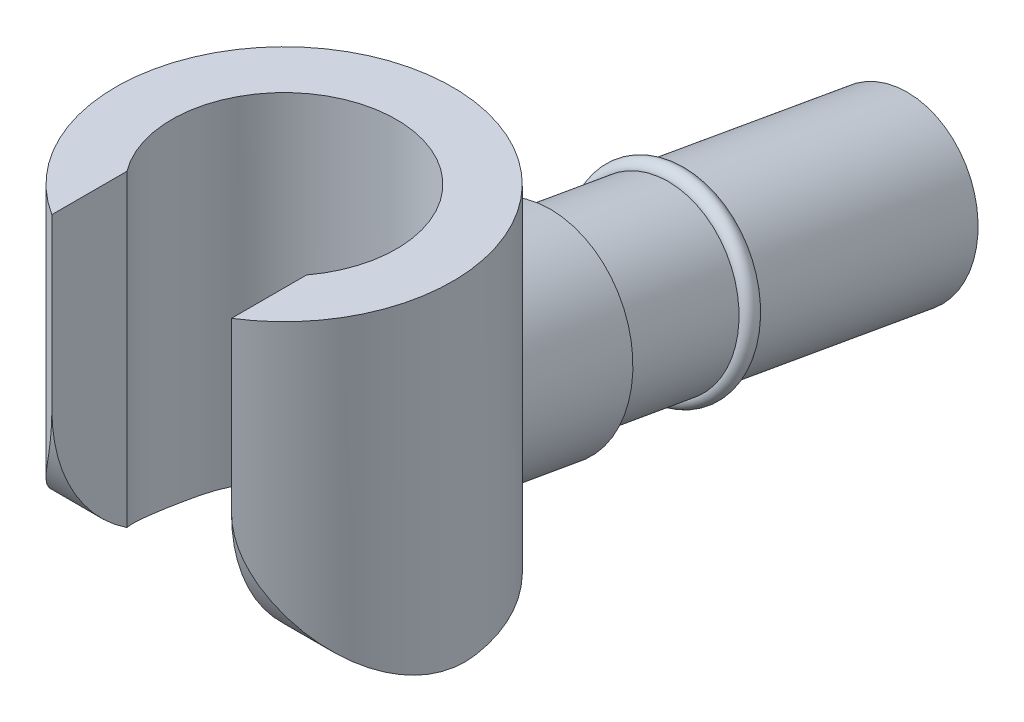
ISO-10303-21;
HEADER;
FILE_DESCRIPTION(('STEP AP214'),'2;1');
FILE_NAME('part.step','',(''),(''),'','','');
FILE_SCHEMA(('AUTOMOTIVE_DESIGN { 1 0 10303 214 1 1 1 1 }'));
ENDSEC;
DATA;
#1=APPLICATION_CONTEXT('core data for automotive mechanical design processes');
#2=APPLICATION_PROTOCOL_DEFINITION('international standard','automotive_design',2000,#1);
#3=PRODUCT_CONTEXT('',#1,'mechanical');
#4=PRODUCT('Part','Part','',(#3));
#5=PRODUCT_RELATED_PRODUCT_CATEGORY('part','',(#4));
#6=PRODUCT_DEFINITION_FORMATION('','',#4);
#7=PRODUCT_DEFINITION_CONTEXT('part definition',#1,'design');
#8=PRODUCT_DEFINITION('design','',#6,#7);
#9=PRODUCT_DEFINITION_SHAPE('','',#8);
#10=(LENGTH_UNIT() NAMED_UNIT(*) SI_UNIT(.MILLI.,.METRE.));
#11=(NAMED_UNIT(*) PLANE_ANGLE_UNIT() SI_UNIT($,.RADIAN.));
#12=(NAMED_UNIT(*) SI_UNIT($,.STERADIAN.) SOLID_ANGLE_UNIT());
#13=UNCERTAINTY_MEASURE_WITH_UNIT(LENGTH_MEASURE(1.E-05),#10,'distance_accuracy_value','');
#14=(GEOMETRIC_REPRESENTATION_CONTEXT(3) GLOBAL_UNCERTAINTY_ASSIGNED_CONTEXT((#13)) GLOBAL_UNIT_ASSIGNED_CONTEXT((#10,
#11,#12)) REPRESENTATION_CONTEXT('',''));
#15=CARTESIAN_POINT('',(0.,0.,0.));
#16=DIRECTION('',(0.,0.,1.));
#17=DIRECTION('',(1.,0.,0.));
#18=AXIS2_PLACEMENT_3D('',#15,#16,#17);
#19=CARTESIAN_POINT('',(0.,2.26255128198767,2.45629642090024));
#20=DIRECTION('',(0.,-0.173648177666936,-0.984807753012214));
#21=DIRECTION('',(0.,0.984807753012216,-0.173648177666936));
#22=AXIS2_PLACEMENT_3D('',#19,#20,#21);
#23=CYLINDRICAL_SURFACE('',#22,1.190625);
#24=CARTESIAN_POINT('',(0.,1.20817697351663,-3.52335742580348));
#25=DIRECTION('',(0.,-0.173648177666935,-0.984807753012214));
#26=DIRECTION('',(0.,0.984807753012216,-0.173648177666936));
#27=AXIS2_PLACEMENT_3D('',#24,#25,#26);
#28=CIRCLE('',#27,1.190625);
#29=CARTESIAN_POINT('',(0.,2.3807137044468,-3.73010728733817));
#30=VERTEX_POINT('',#29);
#31=EDGE_CURVE('E11',#30,#30,#28,.F.);
#32=ORIENTED_EDGE('',*,*,#31,.F.);
#33=EDGE_LOOP('',(#32));
#34=FACE_BOUND('',#33,.T.);
#35=CARTESIAN_POINT('',(0.,0.908232061213911,-5.22442955383261));
#36=DIRECTION('',(0.,-0.173648177666935,-0.984807753012214));
#37=DIRECTION('',(0.,0.984807753012216,-0.173648177666936));
#38=AXIS2_PLACEMENT_3D('',#35,#36,#37);
#39=CIRCLE('',#38,1.190625);
#40=CARTESIAN_POINT('',(0.,2.08076879214408,-5.4311794153673));
#41=VERTEX_POINT('',#40);
#42=EDGE_CURVE('E40',#41,#41,#39,.F.);
#43=ORIENTED_EDGE('',*,*,#42,.T.);
#44=EDGE_LOOP('',(#43));
#45=FACE_BOUND('',#44,.T.);
#46=ADVANCED_FACE('F35',(#34,#45),#23,.T.);
#47=CARTESIAN_POINT('',(0.,4.76250000000001,0.));
#48=DIRECTION('',(0.,1.00000000000001,0.));
#49=DIRECTION('',(0.,0.,1.00000000000001));
#50=AXIS2_PLACEMENT_3D('',#47,#48,#49);
#51=PLANE('',#50);
#52=DIRECTION('',(0.,0.,1.00000000000001));
#53=VECTOR('',#52,1.);
#54=CARTESIAN_POINT('',(-1.27000000000003,4.76250000000003,3.49250000000005));
#55=LINE('',#54,#53);
#56=CARTESIAN_POINT('',(-1.27000000000001,4.76250000000001,0.952500000000034));
#57=VERTEX_POINT('',#56);
#58=CARTESIAN_POINT('',(-1.27,4.7625,2.01431168454639));
#59=VERTEX_POINT('',#58);
#60=EDGE_CURVE('E115',#57,#59,#55,.T.);
#61=ORIENTED_EDGE('',*,*,#60,.F.);
#62=CARTESIAN_POINT('',(0.,4.76250000000001,0.));
#63=DIRECTION('',(0.,1.00000000000001,0.));
#64=DIRECTION('',(0.,0.,1.00000000000001));
#65=AXIS2_PLACEMENT_3D('',#62,#63,#64);
#66=CIRCLE('',#65,1.5875);
#67=CARTESIAN_POINT('',(1.26999999999997,4.76250000000007,0.952500000000031));
#68=VERTEX_POINT('',#67);
#69=EDGE_CURVE('E121',#68,#57,#66,.T.);
#70=ORIENTED_EDGE('',*,*,#69,.F.);
#71=DIRECTION('',(0.,0.,-1.00000000000001));
#72=VECTOR('',#71,1.);
#73=CARTESIAN_POINT('',(1.26999999999998,4.76250000000002,3.49250000000005));
#74=LINE('',#73,#72);
#75=CARTESIAN_POINT('',(1.27000000000001,4.7625,2.01431168454639));
#76=VERTEX_POINT('',#75);
#77=EDGE_CURVE('E292',#76,#68,#74,.T.);
#78=ORIENTED_EDGE('',*,*,#77,.F.);
#79=CARTESIAN_POINT('',(0.,4.76250000000001,0.));
#80=DIRECTION('',(0.,1.00000000000001,0.));
#81=DIRECTION('',(0.,0.,1.00000000000001));
#82=AXIS2_PLACEMENT_3D('',#79,#80,#81);
#83=CIRCLE('',#82,2.38125);
#84=EDGE_CURVE('E111',#76,#59,#83,.T.);
#85=ORIENTED_EDGE('',*,*,#84,.T.);
#86=EDGE_LOOP('',(#61,#70,#78,#85));
#87=FACE_BOUND('',#86,.T.);
#88=ADVANCED_FACE('F164',(#87),#51,.T.);
#89=CARTESIAN_POINT('',(0.,0.,0.));
#90=DIRECTION('',(0.,1.00000000000001,0.));
#91=DIRECTION('',(0.,0.,1.00000000000001));
#92=AXIS2_PLACEMENT_3D('',#89,#90,#91);
#93=PLANE('',#92);
#94=CARTESIAN_POINT('',(0.,0.,0.));
#95=DIRECTION('',(0.,1.00000000000001,0.));
#96=DIRECTION('',(0.,0.,1.00000000000001));
#97=AXIS2_PLACEMENT_3D('',#94,#95,#96);
#98=CIRCLE('',#97,2.38125);
#99=CARTESIAN_POINT('',(2.35280849946442,0.,-0.366938315453636));
#100=VERTEX_POINT('',#99);
#101=CARTESIAN_POINT('',(0.,0.,-2.38125));
#102=VERTEX_POINT('',#101);
#103=EDGE_CURVE('E131',#100,#102,#98,.T.);
#104=ORIENTED_EDGE('',*,*,#103,.F.);
#105=DIRECTION('',(1.,0.,0.));
#106=VECTOR('',#105,1.);
#107=CARTESIAN_POINT('',(-2.38124999999999,0.,-0.366938315453613));
#108=LINE('',#107,#106);
#109=CARTESIAN_POINT('',(1.5445104475697,0.,-0.36693831545363));
#110=VERTEX_POINT('',#109);
#111=EDGE_CURVE('E214',#110,#100,#108,.T.);
#112=ORIENTED_EDGE('',*,*,#111,.F.);
#113=CARTESIAN_POINT('',(0.,0.,0.));
#114=DIRECTION('',(0.,1.00000000000001,0.));
#115=DIRECTION('',(0.,0.,1.00000000000001));
#116=AXIS2_PLACEMENT_3D('',#113,#114,#115);
#117=CIRCLE('',#116,1.5875);
#118=CARTESIAN_POINT('',(-1.54451044756971,0.,-0.366938315453627));
#119=VERTEX_POINT('',#118);
#120=EDGE_CURVE('E117',#110,#119,#117,.T.);
#121=ORIENTED_EDGE('',*,*,#120,.T.);
#122=CARTESIAN_POINT('',(-2.35280849946437,0.,-0.36693831545362));
#123=VERTEX_POINT('',#122);
#124=EDGE_CURVE('E217',#123,#119,#108,.T.);
#125=ORIENTED_EDGE('',*,*,#124,.F.);
#126=EDGE_CURVE('E100',#102,#123,#98,.T.);
#127=ORIENTED_EDGE('',*,*,#126,.F.);
#128=EDGE_LOOP('',(#104,#112,#121,#125,#127));
#129=FACE_BOUND('',#128,.T.);
#130=ADVANCED_FACE('F205',(#129),#93,.F.);
#131=CARTESIAN_POINT('',(0.,4.76250000000001,0.));
#132=DIRECTION('',(0.,-1.00000000000001,0.));
#133=DIRECTION('',(0.,0.,-1.00000000000001));
#134=AXIS2_PLACEMENT_3D('',#131,#132,#133);
#135=CYLINDRICAL_SURFACE('',#134,2.38125);
#136=ORIENTED_EDGE('',*,*,#103,.T.);
#137=CARTESIAN_POINT('',(0.,2.81912265510655,-2.38125));
#138=CARTESIAN_POINT('',(0.0747045796572156,2.81912579107448,-2.38125374631095));
#139=CARTESIAN_POINT('',(0.149385088903327,2.81360378097245,-2.37770841714588));
#140=CARTESIAN_POINT('',(0.296483738355653,2.79173704283781,-2.3638743608229));
#141=CARTESIAN_POINT('',(0.368902283545486,2.77539426392966,-2.35358684812505));
#142=CARTESIAN_POINT('',(0.509312109977818,2.73249155811069,-2.32724061387244));
#143=CARTESIAN_POINT('',(0.57731359470601,2.70595623433348,-2.31119579560264));
#144=CARTESIAN_POINT('',(0.70751132566848,2.64337324079094,-2.27472081697133));
#145=CARTESIAN_POINT('',(0.769705690759084,2.60732250299923,-2.25428924259832));
#146=CARTESIAN_POINT('',(0.889824094715473,2.52447635497403,-2.2097197178262));
#147=CARTESIAN_POINT('',(0.947402772687572,2.47725033799423,-2.18545143416963));
#148=CARTESIAN_POINT('',(1.05359803292886,2.37380660529656,-2.13628456547099));
#149=CARTESIAN_POINT('',(1.10220844548083,2.31758274880659,-2.11138555981778));
#150=CARTESIAN_POINT('',(1.19073500714924,2.19474273874581,-2.06279935468717));
#151=CARTESIAN_POINT('',(1.23028437176825,2.12783016596952,-2.03918578797535));
#152=CARTESIAN_POINT('',(1.29685937748784,1.98650422951831,-1.99751467909763));
#153=CARTESIAN_POINT('',(1.32390715705662,1.91210441147608,-1.97944733459785));
#154=CARTESIAN_POINT('',(1.36197546581325,1.76694546780592,-1.95342017400552));
#155=CARTESIAN_POINT('',(1.37447267635764,1.69673967431193,-1.94454224231147));
#156=CARTESIAN_POINT('',(1.38842809651082,1.55471626995253,-1.93460528849596));
#157=CARTESIAN_POINT('',(1.38988997829053,1.48289920324189,-1.93354366538366));
#158=CARTESIAN_POINT('',(1.38268707680189,1.34721676601847,-1.93869409808814));
#159=CARTESIAN_POINT('',(1.37500435612747,1.28326416683205,-1.94420088011607));
#160=CARTESIAN_POINT('',(1.35184625707245,1.15746161198252,-1.96037233336776));
#161=CARTESIAN_POINT('',(1.33636492827444,1.09561330043877,-1.97104094287239));
#162=CARTESIAN_POINT('',(1.29109132110505,0.95191590165433,-2.00110642707088));
#163=CARTESIAN_POINT('',(1.25809173413169,0.871447542320114,-2.02228060513067));
#164=CARTESIAN_POINT('',(1.18009209745056,0.717781445242191,-2.06876642991618));
#165=CARTESIAN_POINT('',(1.13506976313169,0.644597558905059,-2.09408572570341));
#166=CARTESIAN_POINT('',(1.03329995153469,0.506091957283327,-2.14614770162376));
#167=CARTESIAN_POINT('',(0.976429385460564,0.4408651930005,-2.17290293979648));
#168=CARTESIAN_POINT('',(0.851823149985452,0.321037530708833,-2.22469856259292));
#169=CARTESIAN_POINT('',(0.784106129758756,0.266418743927048,-2.24974178722177));
#170=CARTESIAN_POINT('',(0.654293775385925,0.180593225253622,-2.29037728922505));
#171=CARTESIAN_POINT('',(0.594134095313646,0.146877718908268,-2.30684309903259));
#172=CARTESIAN_POINT('',(0.468454429995739,0.0889456160084731,-2.33560365817458));
#173=CARTESIAN_POINT('',(0.402938538839858,0.0647218448689598,-2.347901556984));
#174=CARTESIAN_POINT('',(0.267560349498783,0.0270919687876584,-2.36716340667977));
#175=CARTESIAN_POINT('',(0.197670809890027,0.0137628618545022,-2.37408937420948));
#176=CARTESIAN_POINT('',(0.0563085133204287,-0.000746693032316787,-2.38163357482808));
#177=CARTESIAN_POINT('',(-0.0151633334884328,-0.0019339519794406,-2.3822553442676));
#178=CARTESIAN_POINT('',(-0.148892942619863,0.00734591798894951,-2.37742465606815));
#179=CARTESIAN_POINT('',(-0.211272888206566,0.0165008831292121,-2.37265605510732));
#180=CARTESIAN_POINT('',(-0.333483440154271,0.0438132203361232,-2.35858551488502));
#181=CARTESIAN_POINT('',(-0.393313559526001,0.0619723037987962,-2.3492827138223));
#182=CARTESIAN_POINT('',(-0.510647731471967,0.106913623953572,-2.32664103277905));
#183=CARTESIAN_POINT('',(-0.568049693744741,0.133909431077417,-2.31320274295488));
#184=CARTESIAN_POINT('',(-0.677954904139775,0.19520618317244,-2.2834132727239));
#185=CARTESIAN_POINT('',(-0.730456589015197,0.229509447932186,-2.2670611675822));
#186=CARTESIAN_POINT('',(-0.838526908980091,0.310698368467293,-2.22957939078853));
#187=CARTESIAN_POINT('',(-0.893113930731751,0.358730741505353,-2.2081093646996));
#188=CARTESIAN_POINT('',(-0.994618960631436,0.462024057496228,-2.1642893819985));
#189=CARTESIAN_POINT('',(-1.04152686281241,0.517294356425614,-2.14193831311984));
#190=CARTESIAN_POINT('',(-1.13560931713039,0.645324929605874,-2.09381063698694));
#191=CARTESIAN_POINT('',(-1.18109032473598,0.719402492980442,-2.06820479562384));
#192=CARTESIAN_POINT('',(-1.2597547242214,0.875080308012906,-2.02125503295745));
#193=CARTESIAN_POINT('',(-1.29294719231083,0.956674951767838,-1.99990797155137));
#194=CARTESIAN_POINT('',(-1.3398036984708,1.10748707022035,-1.9687283609328));
#195=CARTESIAN_POINT('',(-1.35613986876176,1.17555953152588,-1.95740349018859));
#196=CARTESIAN_POINT('',(-1.37929598158575,1.31402713923433,-1.94115995531836));
#197=CARTESIAN_POINT('',(-1.38612987735973,1.38441872427579,-1.93623189875122));
#198=CARTESIAN_POINT('',(-1.38940332064802,1.52606690252481,-1.93388719345708));
#199=CARTESIAN_POINT('',(-1.38577659344324,1.59732615018323,-1.93651843730288));
#200=CARTESIAN_POINT('',(-1.36761144819996,1.73774985358159,-1.94938693220331));
#201=CARTESIAN_POINT('',(-1.35307151919521,1.80691401787117,-1.95962523647681));
#202=CARTESIAN_POINT('',(-1.31536007481291,1.93459560603123,-1.98510369275215));
#203=CARTESIAN_POINT('',(-1.29311711534175,1.99350496366871,-1.99979008372814));
#204=CARTESIAN_POINT('',(-1.24068576162168,2.10658436072702,-2.03273384446375));
#205=CARTESIAN_POINT('',(-1.21049446057784,2.16075265661337,-2.05099252001796));
#206=CARTESIAN_POINT('',(-1.13972637319961,2.26848366649389,-2.09121471627852));
#207=CARTESIAN_POINT('',(-1.09843897586353,2.32150819263065,-2.11336522401515));
#208=CARTESIAN_POINT('',(-1.00817059543436,2.42044587532078,-2.15788779674602));
#209=CARTESIAN_POINT('',(-0.959185613427085,2.46635531080601,-2.18025997120478));
#210=CARTESIAN_POINT('',(-0.847626466245124,2.55598235274336,-2.22619981190206));
#211=CARTESIAN_POINT('',(-0.7841144166224,2.59865265885122,-2.24954921357876));
#212=CARTESIAN_POINT('',(-0.649811717696099,2.67343425210132,-2.29195517314623));
#213=CARTESIAN_POINT('',(-0.579018695630262,2.70554208268415,-2.3110103251069));
#214=CARTESIAN_POINT('',(-0.425653579441435,2.76054725812641,-2.34431763440039));
#215=CARTESIAN_POINT('',(-0.342591759641974,2.7824288376896,-2.35802337305237));
#216=CARTESIAN_POINT('',(-0.173007622446984,2.81170983558867,-2.37648436800659));
#217=CARTESIAN_POINT('',(-0.0864876799908675,2.81911902450461,-2.38124566278609));
#218=CARTESIAN_POINT('',(0.,2.81912265510655,-2.38125));
#219=B_SPLINE_CURVE_WITH_KNOTS('',3,(#137,#138,#139,#140,#141,#142,#143,#144,#145,#146,#147,
#148,#149,#150,#151,#152,#153,#154,#155,#156,#157,#158,#159,#160,#161,#162,#163,#164,#165,#166,
#167,#168,#169,#170,#171,#172,#173,#174,#175,#176,#177,#178,#179,#180,#181,#182,#183,#184,#185,
#186,#187,#188,#189,#190,#191,#192,#193,#194,#195,#196,#197,#198,#199,#200,#201,#202,#203,#204,
#205,#206,#207,#208,#209,#210,#211,#212,#213,#214,#215,#216,#217,#218),.UNSPECIFIED.,.T.,.F.,(4,
2,2,2,2,2,2,2,2,2,2,2,2,2,2,2,2,2,2,2,2,2,2,2,2,2,2,2,2,2,2,2,2,2,2,2,2,2,2,2,4),(0.,
0.223791890077953,0.447543479912333,0.670758330115147,0.894045238916025,1.12798634923095,
1.36208780402242,1.60443960140257,1.84636056941526,2.0606758512086,2.27491981323712,
2.46808753668623,2.66140287283004,2.92853536851224,3.19616648301336,3.46673056994617,
3.73683435190842,3.9487040452938,4.16041328086562,4.37360613917281,4.58667939996354,
4.77548115398571,4.96431880696962,5.15810668808142,5.35195618003641,5.57857187860413,
5.80548345400587,6.07616015106952,6.3466365279158,6.55855304934735,6.77015806049821,
6.98310666349066,7.19608475531001,7.38925470984313,7.58249540710089,7.79394781456097,
8.005510437455,8.24437331142769,8.48331427545485,8.74257979709143,9.00167022317274),.UNSPECIFIED.);
#220=EDGE_CURVE('E51',#102,#102,#219,.T.);
#221=ORIENTED_EDGE('',*,*,#220,.F.);
#222=ORIENTED_EDGE('',*,*,#126,.T.);
#223=CARTESIAN_POINT('',(-2.35280849946443,0.,-0.366938315453624));
#224=CARTESIAN_POINT('',(-2.36074691460119,-1.2068697559654E-05,-0.316115349929588));
#225=CARTESIAN_POINT('',(-2.36701472707691,0.00162679818296212,-0.265033719884144));
#226=CARTESIAN_POINT('',(-2.37622889563392,0.00821634244445592,-0.162805266586126));
#227=CARTESIAN_POINT('',(-2.37917659350035,0.0131656806476629,-0.11165847803912));
#228=CARTESIAN_POINT('',(-2.3817674058131,0.0263389998104693,-0.0100731045672685));
#229=CARTESIAN_POINT('',(-2.38143390687972,0.0345394068041282,0.040367929865583));
#230=CARTESIAN_POINT('',(-2.37763068554775,0.0541331937403573,0.140492390723611));
#231=CARTESIAN_POINT('',(-2.37416085452079,0.0655266842674731,0.190175790847151));
#232=CARTESIAN_POINT('',(-2.3592788602558,0.10429942606839,0.337407739102852));
#233=CARTESIAN_POINT('',(-2.34339848093317,0.136299394085299,0.433354093237191));
#234=CARTESIAN_POINT('',(-2.30147710153755,0.211188240909209,0.618566644854465));
#235=CARTESIAN_POINT('',(-2.27541807443287,0.254096391462621,0.707820653609243));
#236=CARTESIAN_POINT('',(-2.20568719486317,0.364212893958312,0.90522260628216));
#237=CARTESIAN_POINT('',(-2.15905186554068,0.434815536643902,1.01042932955947));
#238=CARTESIAN_POINT('',(-2.05640675035323,0.588866865313773,1.20571936102154));
#239=CARTESIAN_POINT('',(-2.00038393576449,0.672333391753616,1.29578129707531));
#240=CARTESIAN_POINT('',(-1.88220087117022,0.851690528469889,1.46228776118599));
#241=CARTESIAN_POINT('',(-1.81994245829478,0.947791172912766,1.5384334321365));
#242=CARTESIAN_POINT('',(-1.69490370000522,1.15035370429416,1.67517243601205));
#243=CARTESIAN_POINT('',(-1.63212298305714,1.25682366997208,1.73575350670034));
#244=CARTESIAN_POINT('',(-1.52871002624278,1.45039626135747,1.82668820862097));
#245=CARTESIAN_POINT('',(-1.48666850069557,1.53498560846977,1.86078812690847));
#246=CARTESIAN_POINT('',(-1.40988122850497,1.71003800492656,1.91960948860366));
#247=CARTESIAN_POINT('',(-1.37509358606246,1.8004631370978,1.94438549276727));
#248=CARTESIAN_POINT('',(-1.32302969628627,1.9713878831929,1.9800970096417));
#249=CARTESIAN_POINT('',(-1.30376434693523,2.05089519083719,1.99268616668889));
#250=CARTESIAN_POINT('',(-1.28384368681271,2.17282703779037,2.00553239947966));
#251=CARTESIAN_POINT('',(-1.27869598109969,2.21421675641082,2.00880942362392));
#252=CARTESIAN_POINT('',(-1.27175576756051,2.29747627555281,2.01320525606891));
#253=CARTESIAN_POINT('',(-1.26997046778589,2.33934691429173,2.01431942798));
#254=CARTESIAN_POINT('',(-1.27000000000028,2.38125000000013,2.01431168454641));
#255=B_SPLINE_CURVE_WITH_KNOTS('',3,(#223,#224,#225,#226,#227,#228,#229,#230,#231,#232,#233,
#234,#235,#236,#237,#238,#239,#240,#241,#242,#243,#244,#245,#246,#247,#248,#249,#250,#251,#252,
#253,#254),.UNSPECIFIED.,.F.,.F.,(4,2,2,2,2,2,2,2,2,2,2,2,2,2,2,4),(0.,0.154259933041382,
0.308457501357623,0.461556832390449,0.614661466295057,0.920225813662717,1.22633380676538,
1.62916503734071,2.03256005252723,2.44379940110731,2.8553617491359,3.15600981434401,
3.45487016101918,3.70198450308616,3.82731662944082,3.95291712811229),.UNSPECIFIED.);
#256=CARTESIAN_POINT('',(-1.26999999999996,2.38125000000003,2.01431168454641));
#257=VERTEX_POINT('',#256);
#258=EDGE_CURVE('E92',#123,#257,#255,.T.);
#259=ORIENTED_EDGE('',*,*,#258,.T.);
#260=DIRECTION('',(0.,-1.00000000000001,0.));
#261=VECTOR('',#260,1.);
#262=CARTESIAN_POINT('',(-1.27,4.7625,2.01431168454639));
#263=LINE('',#262,#261);
#264=EDGE_CURVE('E97',#257,#59,#263,.F.);
#265=ORIENTED_EDGE('',*,*,#264,.T.);
#266=ORIENTED_EDGE('',*,*,#84,.F.);
#267=DIRECTION('',(0.,-1.00000000000001,0.));
#268=VECTOR('',#267,1.);
#269=CARTESIAN_POINT('',(1.27000000000001,4.7625,2.01431168454639));
#270=LINE('',#269,#268);
#271=CARTESIAN_POINT('',(1.26999999999999,2.38125000000005,2.0143116845464));
#272=VERTEX_POINT('',#271);
#273=EDGE_CURVE('E118',#76,#272,#270,.T.);
#274=ORIENTED_EDGE('',*,*,#273,.T.);
#275=CARTESIAN_POINT('',(1.26999999999999,2.38125000000005,2.0143116845464));
#276=CARTESIAN_POINT('',(1.26997027535466,2.33915439355691,2.01431956318027));
#277=CARTESIAN_POINT('',(1.27177216206353,2.29709092732793,2.01319503409209));
#278=CARTESIAN_POINT('',(1.27877513332975,2.2134557945523,2.00875905549905));
#279=CARTESIAN_POINT('',(1.28396859353512,2.1718832373334,2.00545251105094));
#280=CARTESIAN_POINT('',(1.30404102885527,2.04956107591399,1.99250640058312));
#281=CARTESIAN_POINT('',(1.32342905281771,1.96985736225777,1.97983480610646));
#282=CARTESIAN_POINT('',(1.38130500637287,1.78039793811957,1.9401081339886));
#283=CARTESIAN_POINT('',(1.42444916095705,1.67296774359013,1.90916821199795));
#284=CARTESIAN_POINT('',(1.51978139643575,1.46609225650841,1.83421438635602));
#285=CARTESIAN_POINT('',(1.57204963826796,1.36673025359729,1.79008189827782));
#286=CARTESIAN_POINT('',(1.66283505426352,1.20573878715091,1.70526249134317));
#287=CARTESIAN_POINT('',(1.70058578040367,1.141968991517,1.66775665354542));
#288=CARTESIAN_POINT('',(1.77617254978197,1.01821136581489,1.58701795818094));
#289=CARTESIAN_POINT('',(1.81400861985066,0.958224972732181,1.5437829437027));
#290=CARTESIAN_POINT('',(1.92567484880504,0.784425206048282,1.40572566511728));
#291=CARTESIAN_POINT('',(1.9980017908831,0.676206274496108,1.30225408158856));
#292=CARTESIAN_POINT('',(2.11235884282896,0.504968855568886,1.10348871238089));
#293=CARTESIAN_POINT('',(2.15729327276377,0.437640229830746,1.01354733406314));
#294=CARTESIAN_POINT('',(2.23732291692353,0.314855092424158,0.821869489132));
#295=CARTESIAN_POINT('',(2.27243006713262,0.259384198166077,0.720147545186635));
#296=CARTESIAN_POINT('',(2.32478413780096,0.170671422414646,0.523773657253909));
#297=CARTESIAN_POINT('',(2.34399575733284,0.135289054655793,0.430617103820455));
#298=CARTESIAN_POINT('',(2.37117788769177,0.0762458729534974,0.239117061213794));
#299=CARTESIAN_POINT('',(2.37916464804013,0.0525681472180679,0.140781284229733));
#300=CARTESIAN_POINT('',(2.3820652004913,0.0234929169185553,-0.0262838632984338));
#301=CARTESIAN_POINT('',(2.38035153570457,0.0146675931187946,-0.0943881364124209));
#302=CARTESIAN_POINT('',(2.3710344524593,0.00290166271409483,-0.230784958547041));
#303=CARTESIAN_POINT('',(2.36342381560569,-3.17158291256956E-05,-0.299077636028517));
#304=CARTESIAN_POINT('',(2.35280849946442,0.,-0.366938315453634));
#305=B_SPLINE_CURVE_WITH_KNOTS('',3,(#275,#276,#277,#278,#279,#280,#281,#282,#283,#284,#285,
#286,#287,#288,#289,#290,#291,#292,#293,#294,#295,#296,#297,#298,#299,#300,#301,#302,#303,#304),
.UNSPECIFIED.,.F.,.F.,(4,2,2,2,2,2,2,2,2,2,2,2,2,2,4),(0.,0.126178129424468,0.252073578820114,
0.499880877907445,0.857447115297783,1.21832934683477,1.46721631080505,1.71619724298384,
2.21201575607546,2.57378321847714,2.93510936096223,3.23830525916952,3.54106178608997,
3.74666836444504,3.95252702110567),.UNSPECIFIED.);
#306=EDGE_CURVE('E58',#272,#100,#305,.T.);
#307=ORIENTED_EDGE('',*,*,#306,.T.);
#308=EDGE_LOOP('',(#136,#221,#222,#259,#265,#266,#274,#307));
#309=FACE_BOUND('',#308,.T.);
#310=ADVANCED_FACE('F37',(#309),#135,.T.);
#311=CARTESIAN_POINT('',(0.,4.76250000000001,0.));
#312=DIRECTION('',(0.,-1.00000000000001,0.));
#313=DIRECTION('',(0.,0.,-1.00000000000001));
#314=AXIS2_PLACEMENT_3D('',#311,#312,#313);
#315=CYLINDRICAL_SURFACE('',#314,1.5875);
#316=CARTESIAN_POINT('',(1.27000000000002,0.39896997583265,0.952500000000032));
#317=CARTESIAN_POINT('',(1.29454933141902,0.377177009404198,0.919757611906426));
#318=CARTESIAN_POINT('',(1.31797077761305,0.355811616143473,0.885899587600572));
#319=CARTESIAN_POINT('',(1.36239622883397,0.314171660940077,0.81593992494301));
#320=CARTESIAN_POINT('',(1.38339775104169,0.29389823049706,0.779836039804542));
#321=CARTESIAN_POINT('',(1.44275390495037,0.234840981964376,0.667680646851644));
#322=CARTESIAN_POINT('',(1.47708438280203,0.198156450009782,0.588279097925049));
#323=CARTESIAN_POINT('',(1.53309960601288,0.132472721491398,0.421383086402));
#324=CARTESIAN_POINT('',(1.55469275901129,0.103529988227793,0.333835125883592));
#325=CARTESIAN_POINT('',(1.58259818469442,0.0558507538210073,0.154049313019496));
#326=CARTESIAN_POINT('',(1.58899799310465,0.0370562711748046,0.0618414679109788));
#327=CARTESIAN_POINT('',(1.58611152012464,0.0158316746455225,-0.0869817645650183));
#328=CARTESIAN_POINT('',(1.58202706815896,0.00986942601796392,-0.143254166455289));
#329=CARTESIAN_POINT('',(1.56782582214233,0.0019317797583176,-0.255559021930049));
#330=CARTESIAN_POINT('',(1.5576836426936,-2.66860726807835E-05,-0.311589460614373));
#331=CARTESIAN_POINT('',(1.54451044756975,0.,-0.366938315453618));
#332=B_SPLINE_CURVE_WITH_KNOTS('',3,(#316,#317,#318,#319,#320,#321,#322,#323,#324,#325,#326,
#327,#328,#329,#330,#331),.UNSPECIFIED.,.F.,.F.,(4,2,2,2,2,2,2,4),(0.,0.139035778180313,
0.278212958960149,0.558661952047506,0.841103778526653,1.12191433835268,1.29168968094287,
1.4621815222325),.UNSPECIFIED.);
#333=CARTESIAN_POINT('',(1.27000000000002,0.39896997583265,0.952500000000032));
#334=VERTEX_POINT('',#333);
#335=EDGE_CURVE('E188',#334,#110,#332,.T.);
#336=ORIENTED_EDGE('',*,*,#335,.F.);
#337=DIRECTION('',(0.,1.00000000000001,0.));
#338=VECTOR('',#337,1.);
#339=CARTESIAN_POINT('',(1.27000000000001,0.,0.952500000000025));
#340=LINE('',#339,#338);
#341=EDGE_CURVE('E290',#334,#68,#340,.T.);
#342=ORIENTED_EDGE('',*,*,#341,.T.);
#343=ORIENTED_EDGE('',*,*,#69,.T.);
#344=DIRECTION('',(0.,1.00000000000001,0.));
#345=VECTOR('',#344,1.);
#346=CARTESIAN_POINT('',(-1.26999999999998,0.,0.952500000000036));
#347=LINE('',#346,#345);
#348=CARTESIAN_POINT('',(-1.27000000000001,0.398969975832681,0.95250000000003));
#349=VERTEX_POINT('',#348);
#350=EDGE_CURVE('E124',#349,#57,#347,.T.);
#351=ORIENTED_EDGE('',*,*,#350,.F.);
#352=CARTESIAN_POINT('',(-1.54451044756971,0.,-0.366938315453626));
#353=CARTESIAN_POINT('',(-1.55351147714104,-7.67231828489433E-06,-0.329082989153885));
#354=CARTESIAN_POINT('',(-1.56110657172863,0.000902523468030319,-0.290893747608594));
#355=CARTESIAN_POINT('',(-1.5734662903076,0.00459781833388833,-0.214158700607682));
#356=CARTESIAN_POINT('',(-1.57823155895258,0.00738249008643361,-0.175612978394323));
#357=CARTESIAN_POINT('',(-1.58488823294361,0.0148335044776379,-0.0987923415207373));
#358=CARTESIAN_POINT('',(-1.58680413649188,0.0194833651871785,-0.0605179678715101));
#359=CARTESIAN_POINT('',(-1.587880748464,0.0306409239906408,0.0157867570222347));
#360=CARTESIAN_POINT('',(-1.5870414853482,0.0371486028930257,0.0538171107833645));
#361=CARTESIAN_POINT('',(-1.58048546540084,0.059388843470966,0.167111644309233));
#362=CARTESIAN_POINT('',(-1.5707370960686,0.0778464187667748,0.241659416137638));
#363=CARTESIAN_POINT('',(-1.5413933511266,0.121236084125441,0.387045062750628));
#364=CARTESIAN_POINT('',(-1.52175917745969,0.146193495828226,0.457867096335911));
#365=CARTESIAN_POINT('',(-1.47008137050969,0.205714218341752,0.604978297529585));
#366=CARTESIAN_POINT('',(-1.43657992906995,0.241168613348314,0.680397475234221));
#367=CARTESIAN_POINT('',(-1.37914288780141,0.298020983060083,0.787243935417634));
#368=CARTESIAN_POINT('',(-1.35885317156677,0.317535763927317,0.821742043683695));
#369=CARTESIAN_POINT('',(-1.31605369952709,0.35755980092857,0.88866675135476));
#370=CARTESIAN_POINT('',(-1.2935462084704,0.378068031907499,0.921095409395401));
#371=CARTESIAN_POINT('',(-1.27000000000001,0.398969975832681,0.952500000000031));
#372=B_SPLINE_CURVE_WITH_KNOTS('',3,(#352,#353,#354,#355,#356,#357,#358,#359,#360,#361,#362,
#363,#364,#365,#366,#367,#368,#369,#370,#371),.UNSPECIFIED.,.F.,.F.,(4,2,2,2,2,2,2,2,2,4),(0.,
0.116693912736062,0.233361231597543,0.349019552268394,0.464676678214915,0.69575178565147,
0.927740928334278,1.1959111376547,1.32939932446445,1.46275258129682),.UNSPECIFIED.);
#373=EDGE_CURVE('E104',#119,#349,#372,.T.);
#374=ORIENTED_EDGE('',*,*,#373,.F.);
#375=ORIENTED_EDGE('',*,*,#120,.F.);
#376=EDGE_LOOP('',(#336,#342,#343,#351,#374,#375));
#377=FACE_BOUND('',#376,.T.);
#378=ADVANCED_FACE('F198',(#377),#315,.F.);
#379=CARTESIAN_POINT('',(1.26999999999999,0.,3.49250000000005));
#380=DIRECTION('',(1.,0.,0.));
#381=DIRECTION('',(0.,0.,-1.00000000000001));
#382=AXIS2_PLACEMENT_3D('',#379,#380,#381);
#383=PLANE('',#382);
#384=ORIENTED_EDGE('',*,*,#341,.F.);
#385=CARTESIAN_POINT('',(1.27,2.38125,-0.366938315453628));
#386=DIRECTION('',(1.,0.,0.));
#387=DIRECTION('',(0.,0.,-1.00000000000001));
#388=AXIS2_PLACEMENT_3D('',#385,#386,#387);
#389=CIRCLE('',#388,2.38125);
#390=EDGE_CURVE('E103',#334,#272,#389,.F.);
#391=ORIENTED_EDGE('',*,*,#390,.T.);
#392=ORIENTED_EDGE('',*,*,#273,.F.);
#393=ORIENTED_EDGE('',*,*,#77,.T.);
#394=EDGE_LOOP('',(#384,#391,#392,#393));
#395=FACE_BOUND('',#394,.T.);
#396=ADVANCED_FACE('F170',(#395),#383,.F.);
#397=CARTESIAN_POINT('',(-1.26999999999999,0.,3.49250000000005));
#398=DIRECTION('',(-1.,0.,0.));
#399=DIRECTION('',(0.,0.,1.00000000000001));
#400=AXIS2_PLACEMENT_3D('',#397,#398,#399);
#401=PLANE('',#400);
#402=ORIENTED_EDGE('',*,*,#264,.F.);
#403=CARTESIAN_POINT('',(-1.26999999999999,2.38124999999999,-0.36693831545362));
#404=DIRECTION('',(-1.,0.,0.));
#405=DIRECTION('',(0.,0.,1.00000000000001));
#406=AXIS2_PLACEMENT_3D('',#403,#404,#405);
#407=CIRCLE('',#406,2.38125);
#408=EDGE_CURVE('E45',#257,#349,#407,.F.);
#409=ORIENTED_EDGE('',*,*,#408,.T.);
#410=ORIENTED_EDGE('',*,*,#350,.T.);
#411=ORIENTED_EDGE('',*,*,#60,.T.);
#412=EDGE_LOOP('',(#402,#409,#410,#411));
#413=FACE_BOUND('',#412,.T.);
#414=ADVANCED_FACE('F113',(#413),#401,.F.);
#415=CARTESIAN_POINT('',(-2.38124999999996,2.38125,-0.366938315453624));
#416=DIRECTION('',(1.,0.,0.));
#417=DIRECTION('',(0.,0.,-1.00000000000001));
#418=AXIS2_PLACEMENT_3D('',#415,#416,#417);
#419=CYLINDRICAL_SURFACE('',#418,2.38125);
#420=ORIENTED_EDGE('',*,*,#124,.T.);
#421=ORIENTED_EDGE('',*,*,#373,.T.);
#422=ORIENTED_EDGE('',*,*,#408,.F.);
#423=ORIENTED_EDGE('',*,*,#258,.F.);
#424=EDGE_LOOP('',(#420,#421,#422,#423));
#425=FACE_BOUND('',#424,.T.);
#426=ADVANCED_FACE('F107',(#425),#419,.T.);
#427=ORIENTED_EDGE('',*,*,#306,.F.);
#428=ORIENTED_EDGE('',*,*,#390,.F.);
#429=ORIENTED_EDGE('',*,*,#335,.T.);
#430=ORIENTED_EDGE('',*,*,#111,.T.);
#431=EDGE_LOOP('',(#427,#428,#429,#430));
#432=FACE_BOUND('',#431,.T.);
#433=ADVANCED_FACE('F166',(#432),#419,.T.);
#434=CARTESIAN_POINT('',(0.,2.26255128198768,2.45629642090025));
#435=DIRECTION('',(0.,-0.173648177666935,-0.984807753012213));
#436=DIRECTION('',(0.,0.984807753012216,-0.173648177666936));
#437=AXIS2_PLACEMENT_3D('',#434,#435,#436);
#438=CYLINDRICAL_SURFACE('',#437,1.38814692372064);
#439=CARTESIAN_POINT('',(0.,1.20817697351663,-3.52335742580348));
#440=DIRECTION('',(0.,-0.173648177666935,-0.984807753012214));
#441=DIRECTION('',(0.,0.984807753012216,-0.173648177666936));
#442=AXIS2_PLACEMENT_3D('',#439,#440,#441);
#443=CIRCLE('',#442,1.38814692372064);
#444=CARTESIAN_POINT('',(0.,2.57523482631677,-3.76440660944153));
#445=VERTEX_POINT('',#444);
#446=EDGE_CURVE('E139',#445,#445,#443,.T.);
#447=ORIENTED_EDGE('',*,*,#446,.F.);
#448=EDGE_LOOP('',(#447));
#449=FACE_BOUND('',#448,.T.);
#450=ORIENTED_EDGE('',*,*,#220,.T.);
#451=EDGE_LOOP('',(#450));
#452=FACE_BOUND('',#451,.T.);
#453=ADVANCED_FACE('F151',(#449,#452),#438,.T.);
#454=CARTESIAN_POINT('',(0.,1.20817697351663,-3.52335742580348));
#455=DIRECTION('',(0.,-0.173648177666935,-0.984807753012214));
#456=DIRECTION('',(0.,0.984807753012216,-0.173648177666936));
#457=AXIS2_PLACEMENT_3D('',#454,#455,#456);
#458=PLANE('',#457);
#459=ORIENTED_EDGE('',*,*,#31,.T.);
#460=EDGE_LOOP('',(#459));
#461=FACE_BOUND('',#460,.T.);
#462=ORIENTED_EDGE('',*,*,#446,.T.);
#463=EDGE_LOOP('',(#462));
#464=FACE_BOUND('',#463,.T.);
#465=ADVANCED_FACE('F238',(#461,#464),#458,.T.);
#466=CARTESIAN_POINT('',(0.,0.8861787426502,-5.34950013846535));
#467=DIRECTION('',(0.,0.173648177666935,0.984807753012214));
#468=DIRECTION('',(0.,-0.984807753012216,0.173648177666936));
#469=AXIS2_PLACEMENT_3D('',#466,#467,#468);
#470=TOROIDAL_SURFACE('',#469,1.190625,0.127000000000156);
#471=ORIENTED_EDGE('',*,*,#42,.F.);
#472=EDGE_LOOP('',(#471));
#473=FACE_BOUND('',#472,.T.);
#474=CARTESIAN_POINT('',(0.,0.864125424086499,-5.47457072309803));
#475=DIRECTION('',(0.,0.173648177666935,0.984807753012214));
#476=DIRECTION('',(0.,-0.984807753012216,0.173648177666936));
#477=AXIS2_PLACEMENT_3D('',#474,#475,#476);
#478=CIRCLE('',#477,1.190625);
#479=CARTESIAN_POINT('',(0.,-0.308411306843671,-5.26782086156333));
#480=VERTEX_POINT('',#479);
#481=EDGE_CURVE('E132',#480,#480,#478,.F.);
#482=ORIENTED_EDGE('',*,*,#481,.F.);
#483=EDGE_LOOP('',(#482));
#484=FACE_BOUND('',#483,.T.);
#485=ADVANCED_FACE('F160',(#473,#484),#470,.T.);
#486=CARTESIAN_POINT('',(0.,0.312260906866296,-8.60434992650087));
#487=DIRECTION('',(0.,-0.173648177666935,-0.984807753012214));
#488=DIRECTION('',(0.,0.984807753012216,-0.173648177666936));
#489=AXIS2_PLACEMENT_3D('',#486,#487,#488);
#490=PLANE('',#489);
#491=CARTESIAN_POINT('',(0.,0.312260906866296,-8.60434992650087));
#492=DIRECTION('',(0.,-0.173648177666935,-0.984807753012214));
#493=DIRECTION('',(0.,0.984807753012216,-0.173648177666936));
#494=AXIS2_PLACEMENT_3D('',#491,#492,#493);
#495=CIRCLE('',#494,1.190625);
#496=CARTESIAN_POINT('',(0.,1.48479763779647,-8.81109978803556));
#497=VERTEX_POINT('',#496);
#498=EDGE_CURVE('E142',#497,#497,#495,.T.);
#499=ORIENTED_EDGE('',*,*,#498,.T.);
#500=EDGE_LOOP('',(#499));
#501=FACE_BOUND('',#500,.T.);
#502=ADVANCED_FACE('F156',(#501),#490,.T.);
#503=ORIENTED_EDGE('',*,*,#498,.F.);
#504=EDGE_LOOP('',(#503));
#505=FACE_BOUND('',#504,.T.);
#506=ORIENTED_EDGE('',*,*,#481,.T.);
#507=EDGE_LOOP('',(#506));
#508=FACE_BOUND('',#507,.T.);
#509=ADVANCED_FACE('F159',(#505,#508),#23,.T.);
#510=CLOSED_SHELL('',(#46,#88,#130,#310,#378,#396,#414,#426,#433,#453,#465,#485,#502,#509));
#511=MANIFOLD_SOLID_BREP('B2',#510);
#512=ADVANCED_BREP_SHAPE_REPRESENTATION('',(#18,#511),#14);
#513=SHAPE_DEFINITION_REPRESENTATION(#9,#512);
ENDSEC;
END-ISO-10303-21;
